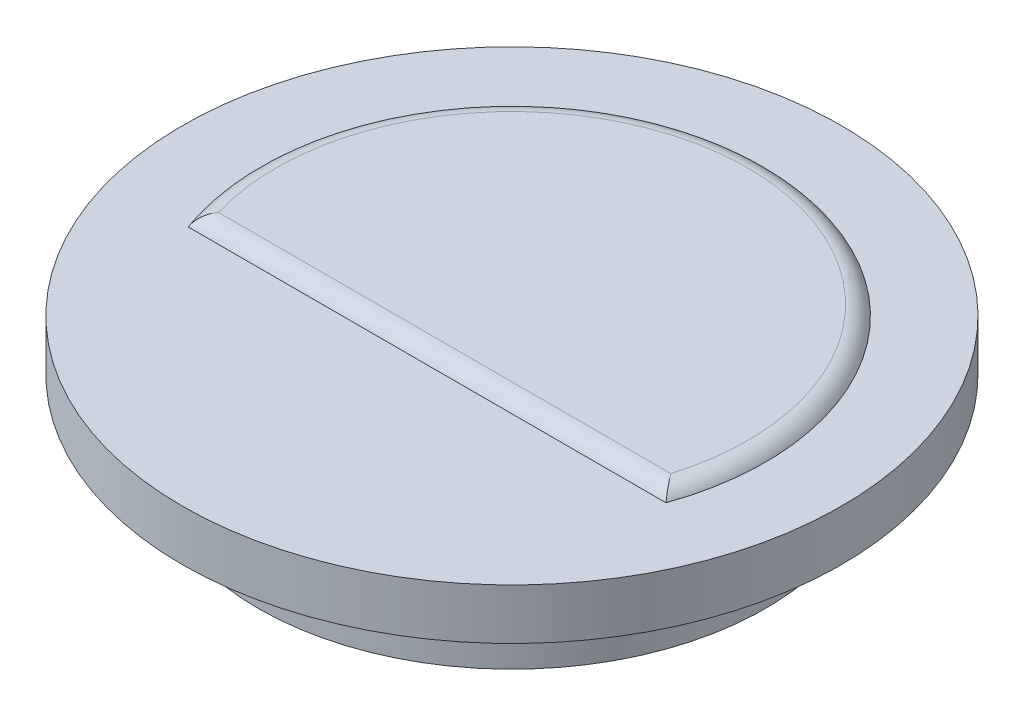
ISO-10303-21;
HEADER;
FILE_DESCRIPTION(('STEP AP214'),'2;1');
FILE_NAME('part.step','',(''),(''),'','','');
FILE_SCHEMA(('AUTOMOTIVE_DESIGN { 1 0 10303 214 1 1 1 1 }'));
ENDSEC;
DATA;
#1=APPLICATION_CONTEXT('core data for automotive mechanical design processes');
#2=APPLICATION_PROTOCOL_DEFINITION('international standard','automotive_design',2000,#1);
#3=PRODUCT_CONTEXT('',#1,'mechanical');
#4=PRODUCT('Part','Part','',(#3));
#5=PRODUCT_RELATED_PRODUCT_CATEGORY('part','',(#4));
#6=PRODUCT_DEFINITION_FORMATION('','',#4);
#7=PRODUCT_DEFINITION_CONTEXT('part definition',#1,'design');
#8=PRODUCT_DEFINITION('design','',#6,#7);
#9=PRODUCT_DEFINITION_SHAPE('','',#8);
#10=(LENGTH_UNIT() NAMED_UNIT(*) SI_UNIT(.MILLI.,.METRE.));
#11=(NAMED_UNIT(*) PLANE_ANGLE_UNIT() SI_UNIT($,.RADIAN.));
#12=(NAMED_UNIT(*) SI_UNIT($,.STERADIAN.) SOLID_ANGLE_UNIT());
#13=UNCERTAINTY_MEASURE_WITH_UNIT(LENGTH_MEASURE(1.E-05),#10,'distance_accuracy_value','');
#14=(GEOMETRIC_REPRESENTATION_CONTEXT(3) GLOBAL_UNCERTAINTY_ASSIGNED_CONTEXT((#13)) GLOBAL_UNIT_ASSIGNED_CONTEXT((#10,
#11,#12)) REPRESENTATION_CONTEXT('',''));
#15=CARTESIAN_POINT('',(0.,0.,0.));
#16=DIRECTION('',(0.,0.,1.));
#17=DIRECTION('',(1.,0.,0.));
#18=AXIS2_PLACEMENT_3D('',#15,#16,#17);
#19=CARTESIAN_POINT('',(0.,-15.,0.));
#20=DIRECTION('',(0.,1.,0.));
#21=DIRECTION('',(0.,0.,1.));
#22=AXIS2_PLACEMENT_3D('',#19,#20,#21);
#23=CYLINDRICAL_SURFACE('',#22,50.);
#24=CARTESIAN_POINT('',(0.,-15.,0.));
#25=DIRECTION('',(0.,-1.,0.));
#26=DIRECTION('',(0.,0.,-1.));
#27=AXIS2_PLACEMENT_3D('',#24,#25,#26);
#28=CIRCLE('',#27,50.);
#29=CARTESIAN_POINT('',(0.,-15.,-50.));
#30=VERTEX_POINT('',#29);
#31=EDGE_CURVE('E11',#30,#30,#28,.T.);
#32=ORIENTED_EDGE('',*,*,#31,.F.);
#33=EDGE_LOOP('',(#32));
#34=FACE_BOUND('',#33,.T.);
#35=CARTESIAN_POINT('',(0.,0.,0.));
#36=DIRECTION('',(0.,-1.,0.));
#37=DIRECTION('',(0.,0.,-1.));
#38=AXIS2_PLACEMENT_3D('',#35,#36,#37);
#39=CIRCLE('',#38,50.);
#40=CARTESIAN_POINT('',(0.,0.,-50.));
#41=VERTEX_POINT('',#40);
#42=EDGE_CURVE('E51',#41,#41,#39,.T.);
#43=ORIENTED_EDGE('',*,*,#42,.T.);
#44=EDGE_LOOP('',(#43));
#45=FACE_BOUND('',#44,.T.);
#46=ADVANCED_FACE('F48',(#34,#45),#23,.T.);
#47=CARTESIAN_POINT('',(0.,-15.,0.));
#48=DIRECTION('',(0.,-1.,0.));
#49=DIRECTION('',(0.,0.,-1.));
#50=AXIS2_PLACEMENT_3D('',#47,#48,#49);
#51=PLANE('',#50);
#52=ORIENTED_EDGE('',*,*,#31,.T.);
#53=EDGE_LOOP('',(#52));
#54=FACE_BOUND('',#53,.T.);
#55=ADVANCED_FACE('F65',(#54),#51,.T.);
#56=CARTESIAN_POINT('',(0.,0.,0.));
#57=DIRECTION('',(0.,-1.,0.));
#58=DIRECTION('',(0.,0.,-1.));
#59=AXIS2_PLACEMENT_3D('',#56,#57,#58);
#60=PLANE('',#59);
#61=ORIENTED_EDGE('',*,*,#42,.F.);
#62=EDGE_LOOP('',(#61));
#63=FACE_BOUND('',#62,.T.);
#64=ADVANCED_FACE('F63',(#63),#60,.F.);
#65=CLOSED_SHELL('',(#46,#55,#64));
#66=MANIFOLD_SOLID_BREP('B2',#65);
#67=CARTESIAN_POINT('',(0.,12.,0.));
#68=DIRECTION('',(0.,-1.,0.));
#69=DIRECTION('',(0.,0.,-1.));
#70=AXIS2_PLACEMENT_3D('',#67,#68,#69);
#71=PLANE('',#70);
#72=CARTESIAN_POINT('',(0.,12.,0.));
#73=DIRECTION('',(0.,-1.,0.));
#74=DIRECTION('',(0.,0.,-1.));
#75=AXIS2_PLACEMENT_3D('',#72,#73,#74);
#76=CIRCLE('',#75,46.5358983848622);
#77=CARTESIAN_POINT('',(44.604403281595,12.,13.2678953259009));
#78=VERTEX_POINT('',#77);
#79=CARTESIAN_POINT('',(-44.604403281595,12.,13.2678953259009));
#80=VERTEX_POINT('',#79);
#81=EDGE_CURVE('E114',#78,#80,#76,.F.);
#82=ORIENTED_EDGE('',*,*,#81,.T.);
#83=DIRECTION('',(-1.,0.,0.));
#84=VECTOR('',#83,1.);
#85=CARTESIAN_POINT('',(0.,12.,13.2678953259009));
#86=LINE('',#85,#84);
#87=EDGE_CURVE('E46',#80,#78,#86,.F.);
#88=ORIENTED_EDGE('',*,*,#87,.T.);
#89=EDGE_LOOP('',(#82,#88));
#90=FACE_BOUND('',#89,.T.);
#91=ADVANCED_FACE('F100',(#90),#71,.F.);
#92=CARTESIAN_POINT('',(0.,10.,0.));
#93=DIRECTION('',(0.,-1.,0.));
#94=DIRECTION('',(0.,0.,-1.));
#95=AXIS2_PLACEMENT_3D('',#92,#93,#94);
#96=PLANE('',#95);
#97=CARTESIAN_POINT('',(0.,10.,0.));
#98=DIRECTION('',(0.,1.,0.));
#99=DIRECTION('',(0.,0.,-1.));
#100=AXIS2_PLACEMENT_3D('',#97,#98,#99);
#101=CIRCLE('',#100,50.);
#102=CARTESIAN_POINT('',(47.117303385965,10.,16.7319969410387));
#103=VERTEX_POINT('',#102);
#104=CARTESIAN_POINT('',(-47.117303385965,10.,16.7319969410387));
#105=VERTEX_POINT('',#104);
#106=EDGE_CURVE('E138',#103,#105,#101,.T.);
#107=ORIENTED_EDGE('',*,*,#106,.F.);
#108=DIRECTION('',(1.,0.,0.));
#109=VECTOR('',#108,1.);
#110=CARTESIAN_POINT('',(-47.117303385965,10.,16.7319969410387));
#111=LINE('',#110,#109);
#112=EDGE_CURVE('E136',#105,#103,#111,.T.);
#113=ORIENTED_EDGE('',*,*,#112,.F.);
#114=EDGE_LOOP('',(#107,#113));
#115=FACE_BOUND('',#114,.T.);
#116=ADVANCED_FACE('F141',(#115),#96,.T.);
#117=CARTESIAN_POINT('',(0.,8.,0.));
#118=DIRECTION('',(0.,1.,0.));
#119=DIRECTION('',(0.,0.,1.));
#120=AXIS2_PLACEMENT_3D('',#117,#118,#119);
#121=TOROIDAL_SURFACE('',#120,46.5358983848622,4.);
#122=CARTESIAN_POINT('',(47.117303385965,10.,16.7319969410387));
#123=CARTESIAN_POINT('',(47.0754037295851,10.1028039319426,16.6726541077256));
#124=CARTESIAN_POINT('',(47.030593572587,10.2020057140804,16.6092693340941));
#125=CARTESIAN_POINT('',(46.9358345694655,10.3927302929528,16.4754449769989));
#126=CARTESIAN_POINT('',(46.8858916151635,10.4842616799363,16.4050134847108));
#127=CARTESIAN_POINT('',(46.7818392426779,10.658755348068,16.258531769805));
#128=CARTESIAN_POINT('',(46.727763530431,10.7417762329627,16.1825271716732));
#129=CARTESIAN_POINT('',(46.6156929362887,10.8998519917839,16.0253028822484));
#130=CARTESIAN_POINT('',(46.5576969395906,10.9749045840548,15.944081707859));
#131=CARTESIAN_POINT('',(46.3792020977289,11.1872517725846,15.6946047306533));
#132=CARTESIAN_POINT('',(46.2536196978477,11.3126854997641,15.5197223874317));
#133=CARTESIAN_POINT('',(45.9923483623804,11.5319195821045,15.1574909809627));
#134=CARTESIAN_POINT('',(45.8566304710814,11.6256247169455,14.9701063767338));
#135=CARTESIAN_POINT('',(45.5408028376537,11.8026832700866,14.5360931104905));
#136=CARTESIAN_POINT('',(45.3585748041632,11.8764663133974,14.2870906691692));
#137=CARTESIAN_POINT('',(44.9884294853156,11.9747351600207,13.7844850968732));
#138=CARTESIAN_POINT('',(44.8005260377271,11.9993323688786,13.5308936786217));
#139=CARTESIAN_POINT('',(44.6095527416116,11.9999955319403,13.2747998114732));
#140=CARTESIAN_POINT('',(44.6069780545995,12.0000000009659,13.2713474754779));
#141=CARTESIAN_POINT('',(44.604403281595,12.,13.2678953259009));
#142=B_SPLINE_CURVE_WITH_KNOTS('',3,(#122,#123,#124,#125,#126,#127,#128,#129,#130,#131,#132,
#133,#134,#135,#136,#137,#138,#139,#140,#141),.UNSPECIFIED.,.F.,.F.,(4,2,2,2,2,2,2,2,2,4),(0.,
0.37739206671824,0.75435567219804,1.12851905138496,1.50278928187521,2.2472461713256,
2.99391784005486,3.94150765806552,4.88694875010142,4.89986883626428),.UNSPECIFIED.);
#143=EDGE_CURVE('E127',#103,#78,#142,.T.);
#144=ORIENTED_EDGE('',*,*,#143,.F.);
#145=ORIENTED_EDGE('',*,*,#106,.T.);
#146=CARTESIAN_POINT('',(-47.117303385965,10.,16.7319969410387));
#147=CARTESIAN_POINT('',(-47.0754037295851,10.1028039319426,16.6726541077256));
#148=CARTESIAN_POINT('',(-47.030593572587,10.2020057140803,16.6092693340941));
#149=CARTESIAN_POINT('',(-46.9358345694655,10.3927302929528,16.4754449769989));
#150=CARTESIAN_POINT('',(-46.8858916151635,10.4842616799363,16.4050134847108));
#151=CARTESIAN_POINT('',(-46.7818392426779,10.658755348068,16.258531769805));
#152=CARTESIAN_POINT('',(-46.7277635304311,10.7417762329627,16.1825271716732));
#153=CARTESIAN_POINT('',(-46.6156929362887,10.8998519917839,16.0253028822484));
#154=CARTESIAN_POINT('',(-46.5576969395906,10.9749045840548,15.944081707859));
#155=CARTESIAN_POINT('',(-46.3792020977289,11.1872517725846,15.6946047306533));
#156=CARTESIAN_POINT('',(-46.2536196978477,11.3126854997641,15.5197223874317));
#157=CARTESIAN_POINT('',(-45.9923483623804,11.5319195821045,15.1574909809627));
#158=CARTESIAN_POINT('',(-45.8566304710814,11.6256247169455,14.9701063767338));
#159=CARTESIAN_POINT('',(-45.5408028376536,11.8026832700866,14.5360931104906));
#160=CARTESIAN_POINT('',(-45.3585748041629,11.8764663133974,14.2870906691694));
#161=CARTESIAN_POINT('',(-44.9884294853159,11.9747351600206,13.784485096873));
#162=CARTESIAN_POINT('',(-44.8005260377281,11.9993323688785,13.530893678621));
#163=CARTESIAN_POINT('',(-44.6095527416117,11.9999955319403,13.2747998114732));
#164=CARTESIAN_POINT('',(-44.6069780545995,12.0000000009659,13.2713474754779));
#165=CARTESIAN_POINT('',(-44.604403281595,12.,13.2678953259009));
#166=B_SPLINE_CURVE_WITH_KNOTS('',3,(#146,#147,#148,#149,#150,#151,#152,#153,#154,#155,#156,
#157,#158,#159,#160,#161,#162,#163,#164,#165),.UNSPECIFIED.,.F.,.F.,(4,2,2,2,2,2,2,2,2,4),(0.,
0.377392066718232,0.754355672198021,1.12851905138494,1.50278928187521,2.24724617132561,
2.99391784005486,3.94150765806551,4.88694875010142,4.89986883626428),.UNSPECIFIED.);
#167=EDGE_CURVE('E105',#80,#105,#166,.F.);
#168=ORIENTED_EDGE('',*,*,#167,.F.);
#169=ORIENTED_EDGE('',*,*,#81,.F.);
#170=EDGE_LOOP('',(#144,#145,#168,#169));
#171=FACE_BOUND('',#170,.T.);
#172=ADVANCED_FACE('F102',(#171),#121,.T.);
#173=CARTESIAN_POINT('',(-47.117303385965,8.,13.2678953259009));
#174=DIRECTION('',(-1.,0.,0.));
#175=DIRECTION('',(0.,0.,1.));
#176=AXIS2_PLACEMENT_3D('',#173,#174,#175);
#177=CYLINDRICAL_SURFACE('',#176,4.);
#178=ORIENTED_EDGE('',*,*,#167,.T.);
#179=ORIENTED_EDGE('',*,*,#112,.T.);
#180=ORIENTED_EDGE('',*,*,#143,.T.);
#181=ORIENTED_EDGE('',*,*,#87,.F.);
#182=EDGE_LOOP('',(#178,#179,#180,#181));
#183=FACE_BOUND('',#182,.T.);
#184=ADVANCED_FACE('F134',(#183),#177,.T.);
#185=CLOSED_SHELL('',(#91,#116,#172,#184));
#186=MANIFOLD_SOLID_BREP('B6',#185);
#187=CARTESIAN_POINT('',(0.,10.,0.));
#188=DIRECTION('',(0.,1.,0.));
#189=DIRECTION('',(0.,0.,1.));
#190=AXIS2_PLACEMENT_3D('',#187,#188,#189);
#191=PLANE('',#190);
#192=CARTESIAN_POINT('',(0.,10.,0.));
#193=DIRECTION('',(0.,1.,0.));
#194=DIRECTION('',(0.,0.,1.));
#195=AXIS2_PLACEMENT_3D('',#192,#193,#194);
#196=CIRCLE('',#195,65.);
#197=CARTESIAN_POINT('',(0.,10.,65.));
#198=VERTEX_POINT('',#197);
#199=EDGE_CURVE('E98',#198,#198,#196,.T.);
#200=ORIENTED_EDGE('',*,*,#199,.T.);
#201=EDGE_LOOP('',(#200));
#202=FACE_BOUND('',#201,.T.);
#203=DIRECTION('',(1.,0.,0.));
#204=VECTOR('',#203,1.);
#205=CARTESIAN_POINT('',(-47.117303385965,10.,16.7319969410387));
#206=LINE('',#205,#204);
#207=CARTESIAN_POINT('',(-47.117303385965,10.,16.7319969410387));
#208=VERTEX_POINT('',#207);
#209=CARTESIAN_POINT('',(47.117303385965,10.,16.7319969410387));
#210=VERTEX_POINT('',#209);
#211=EDGE_CURVE('E225',#208,#210,#206,.T.);
#212=ORIENTED_EDGE('',*,*,#211,.F.);
#213=CARTESIAN_POINT('',(0.,10.,0.));
#214=DIRECTION('',(0.,1.,0.));
#215=DIRECTION('',(0.,0.,1.));
#216=AXIS2_PLACEMENT_3D('',#213,#214,#215);
#217=CIRCLE('',#216,50.);
#218=EDGE_CURVE('E216',#210,#208,#217,.T.);
#219=ORIENTED_EDGE('',*,*,#218,.F.);
#220=EDGE_LOOP('',(#212,#219));
#221=FACE_BOUND('',#220,.T.);
#222=ADVANCED_FACE('F184',(#202,#221),#191,.T.);
#223=CARTESIAN_POINT('',(0.,0.,0.));
#224=DIRECTION('',(0.,1.,0.));
#225=DIRECTION('',(0.,0.,1.));
#226=AXIS2_PLACEMENT_3D('',#223,#224,#225);
#227=PLANE('',#226);
#228=CARTESIAN_POINT('',(0.,0.,0.));
#229=DIRECTION('',(0.,1.,0.));
#230=DIRECTION('',(0.,0.,1.));
#231=AXIS2_PLACEMENT_3D('',#228,#229,#230);
#232=CIRCLE('',#231,65.);
#233=CARTESIAN_POINT('',(0.,0.,65.));
#234=VERTEX_POINT('',#233);
#235=EDGE_CURVE('E188',#234,#234,#232,.T.);
#236=ORIENTED_EDGE('',*,*,#235,.F.);
#237=EDGE_LOOP('',(#236));
#238=FACE_BOUND('',#237,.T.);
#239=CARTESIAN_POINT('',(0.,0.,0.));
#240=DIRECTION('',(0.,1.,0.));
#241=DIRECTION('',(0.,0.,1.));
#242=AXIS2_PLACEMENT_3D('',#239,#240,#241);
#243=CIRCLE('',#242,50.);
#244=CARTESIAN_POINT('',(47.117303385965,0.,16.7319969410387));
#245=VERTEX_POINT('',#244);
#246=CARTESIAN_POINT('',(-47.117303385965,0.,16.7319969410387));
#247=VERTEX_POINT('',#246);
#248=EDGE_CURVE('E206',#245,#247,#243,.T.);
#249=ORIENTED_EDGE('',*,*,#248,.T.);
#250=DIRECTION('',(1.,0.,0.));
#251=VECTOR('',#250,1.);
#252=CARTESIAN_POINT('',(-47.117303385965,0.,16.7319969410387));
#253=LINE('',#252,#251);
#254=EDGE_CURVE('E212',#247,#245,#253,.T.);
#255=ORIENTED_EDGE('',*,*,#254,.T.);
#256=EDGE_LOOP('',(#249,#255));
#257=FACE_BOUND('',#256,.T.);
#258=ADVANCED_FACE('F222',(#238,#257),#227,.F.);
#259=CARTESIAN_POINT('',(0.,10.,0.));
#260=DIRECTION('',(0.,-1.,0.));
#261=DIRECTION('',(0.,0.,-1.));
#262=AXIS2_PLACEMENT_3D('',#259,#260,#261);
#263=CYLINDRICAL_SURFACE('',#262,65.);
#264=ORIENTED_EDGE('',*,*,#199,.F.);
#265=EDGE_LOOP('',(#264));
#266=FACE_BOUND('',#265,.T.);
#267=ORIENTED_EDGE('',*,*,#235,.T.);
#268=EDGE_LOOP('',(#267));
#269=FACE_BOUND('',#268,.T.);
#270=ADVANCED_FACE('F186',(#266,#269),#263,.T.);
#271=CARTESIAN_POINT('',(0.,10.,0.));
#272=DIRECTION('',(0.,-1.,0.));
#273=DIRECTION('',(0.,0.,-1.));
#274=AXIS2_PLACEMENT_3D('',#271,#272,#273);
#275=CYLINDRICAL_SURFACE('',#274,50.);
#276=ORIENTED_EDGE('',*,*,#248,.F.);
#277=DIRECTION('',(0.,-1.,0.));
#278=VECTOR('',#277,1.);
#279=CARTESIAN_POINT('',(47.117303385965,10.,16.7319969410387));
#280=LINE('',#279,#278);
#281=EDGE_CURVE('E214',#210,#245,#280,.T.);
#282=ORIENTED_EDGE('',*,*,#281,.F.);
#283=ORIENTED_EDGE('',*,*,#218,.T.);
#284=DIRECTION('',(0.,-1.,0.));
#285=VECTOR('',#284,1.);
#286=CARTESIAN_POINT('',(-47.117303385965,10.,16.7319969410387));
#287=LINE('',#286,#285);
#288=EDGE_CURVE('E199',#208,#247,#287,.T.);
#289=ORIENTED_EDGE('',*,*,#288,.T.);
#290=EDGE_LOOP('',(#276,#282,#283,#289));
#291=FACE_BOUND('',#290,.T.);
#292=ADVANCED_FACE('F218',(#291),#275,.F.);
#293=CARTESIAN_POINT('',(-47.117303385965,10.,16.7319969410387));
#294=DIRECTION('',(0.,0.,-1.));
#295=DIRECTION('',(-1.,0.,0.));
#296=AXIS2_PLACEMENT_3D('',#293,#294,#295);
#297=PLANE('',#296);
#298=ORIENTED_EDGE('',*,*,#254,.F.);
#299=ORIENTED_EDGE('',*,*,#288,.F.);
#300=ORIENTED_EDGE('',*,*,#211,.T.);
#301=ORIENTED_EDGE('',*,*,#281,.T.);
#302=EDGE_LOOP('',(#298,#299,#300,#301));
#303=FACE_BOUND('',#302,.T.);
#304=ADVANCED_FACE('F213',(#303),#297,.T.);
#305=CLOSED_SHELL('',(#222,#258,#270,#292,#304));
#306=MANIFOLD_SOLID_BREP('B40',#305);
#307=ADVANCED_BREP_SHAPE_REPRESENTATION('',(#18,#66,#186,#306),#14);
#308=SHAPE_DEFINITION_REPRESENTATION(#9,#307);
ENDSEC;
END-ISO-10303-21;
